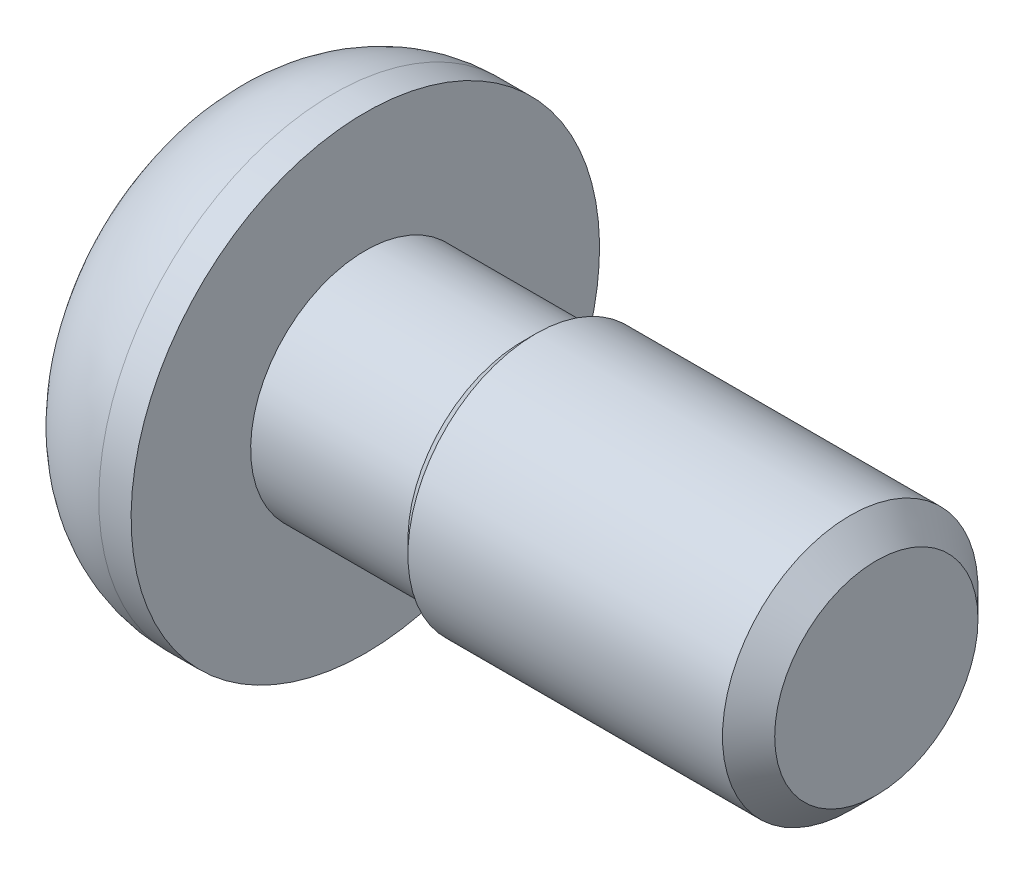
ISO-10303-21;
HEADER;
FILE_DESCRIPTION(('STEP AP214'),'2;1');
FILE_NAME('part.step','',(''),(''),'','','');
FILE_SCHEMA(('AUTOMOTIVE_DESIGN { 1 0 10303 214 1 1 1 1 }'));
ENDSEC;
DATA;
#1=APPLICATION_CONTEXT('core data for automotive mechanical design processes');
#2=APPLICATION_PROTOCOL_DEFINITION('international standard','automotive_design',2000,#1);
#3=PRODUCT_CONTEXT('',#1,'mechanical');
#4=PRODUCT('Part','Part','',(#3));
#5=PRODUCT_RELATED_PRODUCT_CATEGORY('part','',(#4));
#6=PRODUCT_DEFINITION_FORMATION('','',#4);
#7=PRODUCT_DEFINITION_CONTEXT('part definition',#1,'design');
#8=PRODUCT_DEFINITION('design','',#6,#7);
#9=PRODUCT_DEFINITION_SHAPE('','',#8);
#10=(LENGTH_UNIT() NAMED_UNIT(*) SI_UNIT(.MILLI.,.METRE.));
#11=(NAMED_UNIT(*) PLANE_ANGLE_UNIT() SI_UNIT($,.RADIAN.));
#12=(NAMED_UNIT(*) SI_UNIT($,.STERADIAN.) SOLID_ANGLE_UNIT());
#13=UNCERTAINTY_MEASURE_WITH_UNIT(LENGTH_MEASURE(1.E-05),#10,'distance_accuracy_value','');
#14=(GEOMETRIC_REPRESENTATION_CONTEXT(3) GLOBAL_UNCERTAINTY_ASSIGNED_CONTEXT((#13)) GLOBAL_UNIT_ASSIGNED_CONTEXT((#10,
#11,#12)) REPRESENTATION_CONTEXT('',''));
#15=CARTESIAN_POINT('',(0.,0.,0.));
#16=DIRECTION('',(0.,0.,1.));
#17=DIRECTION('',(1.,0.,0.));
#18=AXIS2_PLACEMENT_3D('',#15,#16,#17);
#19=CARTESIAN_POINT('',(6.,0.,0.));
#20=DIRECTION('',(-1.,0.,0.));
#21=DIRECTION('',(0.,1.,0.));
#22=AXIS2_PLACEMENT_3D('',#19,#20,#21);
#23=SPHERICAL_SURFACE('',#22,8.00000000001466);
#24=CARTESIAN_POINT('',(-1.85067742904444,0.,0.));
#25=DIRECTION('',(-1.,0.,0.));
#26=DIRECTION('',(0.,-1.,0.));
#27=AXIS2_PLACEMENT_3D('',#24,#25,#26);
#28=CIRCLE('',#27,1.53846153846195);
#29=CARTESIAN_POINT('',(-1.85067742904444,-1.53846153846195,0.));
#30=VERTEX_POINT('',#29);
#31=EDGE_CURVE('E172',#30,#30,#28,.T.);
#32=ORIENTED_EDGE('',*,*,#31,.T.);
#33=EDGE_LOOP('',(#32));
#34=FACE_BOUND('',#33,.T.);
#35=CARTESIAN_POINT('',(6.,0.,1.375));
#36=DIRECTION('',(0.,0.,-1.));
#37=DIRECTION('',(-1.,0.,0.));
#38=AXIS2_PLACEMENT_3D('',#35,#36,#37);
#39=CIRCLE('',#38,7.88095013308894);
#40=CARTESIAN_POINT('',(-1.87241580175934,-0.36666666666667,1.375));
#41=VERTEX_POINT('',#40);
#42=CARTESIAN_POINT('',(-1.87241580175934,0.36666666666667,1.375));
#43=VERTEX_POINT('',#42);
#44=EDGE_CURVE('E11',#41,#43,#39,.T.);
#45=ORIENTED_EDGE('',*,*,#44,.F.);
#46=CARTESIAN_POINT('',(6.,-0.36666666666667,0.));
#47=DIRECTION('',(0.,1.,0.));
#48=DIRECTION('',(0.,0.,1.));
#49=AXIS2_PLACEMENT_3D('',#46,#47,#48);
#50=CIRCLE('',#49,7.99159280467856);
#51=CARTESIAN_POINT('',(-1.93884612384019,-0.36666666666667,0.91666666666667));
#52=VERTEX_POINT('',#51);
#53=EDGE_CURVE('E25',#52,#41,#50,.T.);
#54=ORIENTED_EDGE('',*,*,#53,.F.);
#55=CARTESIAN_POINT('',(-1.93882302641135,-0.91686666666667,0.366666703030308));
#56=CARTESIAN_POINT('',(-1.94236579166882,-0.886222200606678,0.366628670387705));
#57=CARTESIAN_POINT('',(-1.94560835674475,-0.855543983536852,0.369204204670334));
#58=CARTESIAN_POINT('',(-1.95141306925127,-0.794990855893896,0.379424229843119));
#59=CARTESIAN_POINT('',(-1.95397550408806,-0.765115610816673,0.387066574833851));
#60=CARTESIAN_POINT('',(-1.9583447493943,-0.706989514847591,0.407270037804322));
#61=CARTESIAN_POINT('',(-1.96015097760314,-0.678739930056586,0.419834931670268));
#62=CARTESIAN_POINT('',(-1.96295165273787,-0.624719190912915,0.449530912826694));
#63=CARTESIAN_POINT('',(-1.96394635456326,-0.598947260577293,0.466660564087769));
#64=CARTESIAN_POINT('',(-1.96509060656341,-0.550797400114779,0.504868515459533));
#65=CARTESIAN_POINT('',(-1.9652461206589,-0.528396622612462,0.525917848620626));
#66=CARTESIAN_POINT('',(-1.96472336000751,-0.487409172016811,0.571447602649381));
#67=CARTESIAN_POINT('',(-1.96404495900616,-0.468823076962378,0.595928542563994));
#68=CARTESIAN_POINT('',(-1.96187804733257,-0.436044509781448,0.647530766896138));
#69=CARTESIAN_POINT('',(-1.96039204951636,-0.421838622324701,0.674643648138644));
#70=CARTESIAN_POINT('',(-1.95665486221181,-0.398128991564686,0.730799606671975));
#71=CARTESIAN_POINT('',(-1.95440396125797,-0.388623478514725,0.759841952817276));
#72=CARTESIAN_POINT('',(-1.94996832916546,-0.376616544653103,0.810326624124974));
#73=CARTESIAN_POINT('',(-1.94795786421894,-0.372878488434745,0.831499367654234));
#74=CARTESIAN_POINT('',(-1.94362067788188,-0.367899438514063,0.874073712749798));
#75=CARTESIAN_POINT('',(-1.9412944106657,-0.366654898517597,0.895474945714617));
#76=CARTESIAN_POINT('',(-1.93882302641135,-0.366666703030308,0.91686666666667));
#77=B_SPLINE_CURVE_WITH_KNOTS('',3,(#55,#56,#57,#58,#59,#60,#61,#62,#63,#64,#65,#66,#67,#68,#69,
#70,#71,#72,#73,#74,#75,#76),.UNSPECIFIED.,.F.,.F.,(4,2,2,2,2,2,2,2,2,2,4),(0.,
0.0924335454797331,0.184827968421997,0.277293402553931,0.369729782206797,0.461508363362269,
0.553300841476887,0.644809326910827,0.736283332031252,0.800925072979105,0.865474814600254),.UNSPECIFIED.);
#78=CARTESIAN_POINT('',(-1.93884612384019,-0.91666666666667,0.36666666666667));
#79=VERTEX_POINT('',#78);
#80=EDGE_CURVE('E260',#79,#52,#77,.T.);
#81=ORIENTED_EDGE('',*,*,#80,.F.);
#82=CARTESIAN_POINT('',(6.,0.,0.36666666666667));
#83=DIRECTION('',(0.,0.,-1.));
#84=DIRECTION('',(-1.,0.,0.));
#85=AXIS2_PLACEMENT_3D('',#82,#83,#84);
#86=CIRCLE('',#85,7.99159280467856);
#87=CARTESIAN_POINT('',(-1.87241580175934,-1.375,0.36666666666667));
#88=VERTEX_POINT('',#87);
#89=EDGE_CURVE('E265',#88,#79,#86,.T.);
#90=ORIENTED_EDGE('',*,*,#89,.F.);
#91=CARTESIAN_POINT('',(6.,-1.375,0.));
#92=DIRECTION('',(0.,1.,0.));
#93=DIRECTION('',(0.,0.,1.));
#94=AXIS2_PLACEMENT_3D('',#91,#92,#93);
#95=CIRCLE('',#94,7.88095013308894);
#96=CARTESIAN_POINT('',(-1.87241580175934,-1.375,-0.36666666666667));
#97=VERTEX_POINT('',#96);
#98=EDGE_CURVE('E266',#97,#88,#95,.T.);
#99=ORIENTED_EDGE('',*,*,#98,.F.);
#100=CARTESIAN_POINT('',(6.,0.,-0.36666666666667));
#101=DIRECTION('',(0.,0.,1.));
#102=DIRECTION('',(1.,0.,0.));
#103=AXIS2_PLACEMENT_3D('',#100,#101,#102);
#104=CIRCLE('',#103,7.99159280467856);
#105=CARTESIAN_POINT('',(-1.93884612384019,-0.91666666666667,-0.36666666666667));
#106=VERTEX_POINT('',#105);
#107=EDGE_CURVE('E232',#106,#97,#104,.T.);
#108=ORIENTED_EDGE('',*,*,#107,.F.);
#109=CARTESIAN_POINT('',(-1.93882302641135,-0.366666703030308,-0.91686666666667));
#110=CARTESIAN_POINT('',(-1.94236579166882,-0.366628670387707,-0.886222200606679));
#111=CARTESIAN_POINT('',(-1.94560835674475,-0.369204204670335,-0.855543983536852));
#112=CARTESIAN_POINT('',(-1.95141306925127,-0.37942422984312,-0.794990855893896));
#113=CARTESIAN_POINT('',(-1.95397550408806,-0.387066574833852,-0.765115610816673));
#114=CARTESIAN_POINT('',(-1.9583447493943,-0.407270037804323,-0.706989514847591));
#115=CARTESIAN_POINT('',(-1.96015097760314,-0.41983493167027,-0.678739930056586));
#116=CARTESIAN_POINT('',(-1.96295165273787,-0.449530912826696,-0.624719190912915));
#117=CARTESIAN_POINT('',(-1.96394635456326,-0.46666056408777,-0.598947260577292));
#118=CARTESIAN_POINT('',(-1.96509060656341,-0.504868515459534,-0.550797400114778));
#119=CARTESIAN_POINT('',(-1.9652461206589,-0.525917848620627,-0.528396622612462));
#120=CARTESIAN_POINT('',(-1.96472336000751,-0.571447602649383,-0.487409172016812));
#121=CARTESIAN_POINT('',(-1.96404495900616,-0.595928542563995,-0.468823076962378));
#122=CARTESIAN_POINT('',(-1.96187804733257,-0.647530766896139,-0.436044509781448));
#123=CARTESIAN_POINT('',(-1.96039204951636,-0.674643648138646,-0.421838622324702));
#124=CARTESIAN_POINT('',(-1.95665486221181,-0.730799606671977,-0.398128991564687));
#125=CARTESIAN_POINT('',(-1.95440396125797,-0.759841952817277,-0.388623478514724));
#126=CARTESIAN_POINT('',(-1.94996832916546,-0.810326624124975,-0.376616544653103));
#127=CARTESIAN_POINT('',(-1.94795786421894,-0.831499367654235,-0.372878488434746));
#128=CARTESIAN_POINT('',(-1.94362067788188,-0.874073712749799,-0.367899438514065));
#129=CARTESIAN_POINT('',(-1.9412944106657,-0.895474945714618,-0.366654898517598));
#130=CARTESIAN_POINT('',(-1.93882302641135,-0.91686666666667,-0.366666703030308));
#131=B_SPLINE_CURVE_WITH_KNOTS('',3,(#109,#110,#111,#112,#113,#114,#115,#116,#117,#118,#119,
#120,#121,#122,#123,#124,#125,#126,#127,#128,#129,#130),.UNSPECIFIED.,.F.,.F.,(4,2,2,2,2,2,2,2,
2,2,4),(0.,0.0924335454797328,0.184827968421997,0.277293402553931,0.369729782206797,
0.461508363362269,0.553300841476887,0.644809326910827,0.736283332031252,0.800925072979104,
0.865474814600252),.UNSPECIFIED.);
#132=CARTESIAN_POINT('',(-1.93884612384019,-0.36666666666667,-0.91666666666667));
#133=VERTEX_POINT('',#132);
#134=EDGE_CURVE('E226',#133,#106,#131,.T.);
#135=ORIENTED_EDGE('',*,*,#134,.F.);
#136=CARTESIAN_POINT('',(6.,-0.36666666666667,0.));
#137=DIRECTION('',(0.,1.,0.));
#138=DIRECTION('',(0.,0.,1.));
#139=AXIS2_PLACEMENT_3D('',#136,#137,#138);
#140=CIRCLE('',#139,7.99159280467856);
#141=CARTESIAN_POINT('',(-1.87241580175934,-0.36666666666667,-1.375));
#142=VERTEX_POINT('',#141);
#143=EDGE_CURVE('E224',#142,#133,#140,.T.);
#144=ORIENTED_EDGE('',*,*,#143,.F.);
#145=CARTESIAN_POINT('',(6.,0.,-1.375));
#146=DIRECTION('',(0.,0.,1.));
#147=DIRECTION('',(1.,0.,0.));
#148=AXIS2_PLACEMENT_3D('',#145,#146,#147);
#149=CIRCLE('',#148,7.88095013308894);
#150=CARTESIAN_POINT('',(-1.87241580175934,0.36666666666667,-1.375));
#151=VERTEX_POINT('',#150);
#152=EDGE_CURVE('E222',#151,#142,#149,.T.);
#153=ORIENTED_EDGE('',*,*,#152,.F.);
#154=CARTESIAN_POINT('',(6.,0.36666666666667,0.));
#155=DIRECTION('',(0.,-1.,0.));
#156=DIRECTION('',(0.,0.,-1.));
#157=AXIS2_PLACEMENT_3D('',#154,#155,#156);
#158=CIRCLE('',#157,7.99159280467856);
#159=CARTESIAN_POINT('',(-1.93884612384019,0.36666666666667,-0.91666666666667));
#160=VERTEX_POINT('',#159);
#161=EDGE_CURVE('E219',#160,#151,#158,.T.);
#162=ORIENTED_EDGE('',*,*,#161,.F.);
#163=CARTESIAN_POINT('',(-1.93882302641135,0.91686666666667,-0.366666703030308));
#164=CARTESIAN_POINT('',(-1.94236579166882,0.886222200606678,-0.366628670387705));
#165=CARTESIAN_POINT('',(-1.94560835674475,0.855543983536852,-0.369204204670334));
#166=CARTESIAN_POINT('',(-1.95141306925127,0.794990855893896,-0.379424229843119));
#167=CARTESIAN_POINT('',(-1.95397550408806,0.765115610816673,-0.387066574833851));
#168=CARTESIAN_POINT('',(-1.9583447493943,0.706989514847591,-0.407270037804322));
#169=CARTESIAN_POINT('',(-1.96015097760314,0.678739930056586,-0.419834931670268));
#170=CARTESIAN_POINT('',(-1.96295165273787,0.624719190912915,-0.449530912826694));
#171=CARTESIAN_POINT('',(-1.96394635456326,0.598947260577293,-0.466660564087769));
#172=CARTESIAN_POINT('',(-1.96509060656341,0.550797400114779,-0.504868515459533));
#173=CARTESIAN_POINT('',(-1.9652461206589,0.528396622612462,-0.525917848620626));
#174=CARTESIAN_POINT('',(-1.96472336000751,0.487409172016811,-0.571447602649381));
#175=CARTESIAN_POINT('',(-1.96404495900616,0.468823076962378,-0.595928542563994));
#176=CARTESIAN_POINT('',(-1.96187804733257,0.436044509781448,-0.647530766896138));
#177=CARTESIAN_POINT('',(-1.96039204951636,0.421838622324701,-0.674643648138644));
#178=CARTESIAN_POINT('',(-1.95665486221181,0.398128991564686,-0.730799606671975));
#179=CARTESIAN_POINT('',(-1.95440396125797,0.388623478514724,-0.759841952817276));
#180=CARTESIAN_POINT('',(-1.94996832916546,0.376616544653103,-0.810326624124974));
#181=CARTESIAN_POINT('',(-1.94795786421894,0.372878488434745,-0.831499367654234));
#182=CARTESIAN_POINT('',(-1.94362067788188,0.367899438514063,-0.874073712749798));
#183=CARTESIAN_POINT('',(-1.9412944106657,0.366654898517597,-0.895474945714617));
#184=CARTESIAN_POINT('',(-1.93882302641135,0.366666703030308,-0.91686666666667));
#185=B_SPLINE_CURVE_WITH_KNOTS('',3,(#163,#164,#165,#166,#167,#168,#169,#170,#171,#172,#173,
#174,#175,#176,#177,#178,#179,#180,#181,#182,#183,#184),.UNSPECIFIED.,.F.,.F.,(4,2,2,2,2,2,2,2,
2,2,4),(0.,0.0924335454797331,0.184827968421997,0.277293402553931,0.369729782206797,
0.461508363362269,0.553300841476887,0.644809326910827,0.736283332031252,0.800925072979105,
0.865474814600254),.UNSPECIFIED.);
#186=CARTESIAN_POINT('',(-1.93884612384019,0.91666666666667,-0.36666666666667));
#187=VERTEX_POINT('',#186);
#188=EDGE_CURVE('E213',#187,#160,#185,.T.);
#189=ORIENTED_EDGE('',*,*,#188,.F.);
#190=CARTESIAN_POINT('',(6.,0.,-0.36666666666667));
#191=DIRECTION('',(0.,0.,1.));
#192=DIRECTION('',(1.,0.,0.));
#193=AXIS2_PLACEMENT_3D('',#190,#191,#192);
#194=CIRCLE('',#193,7.99159280467856);
#195=CARTESIAN_POINT('',(-1.87241580175934,1.375,-0.36666666666667));
#196=VERTEX_POINT('',#195);
#197=EDGE_CURVE('E220',#196,#187,#194,.T.);
#198=ORIENTED_EDGE('',*,*,#197,.F.);
#199=CARTESIAN_POINT('',(6.,1.375,0.));
#200=DIRECTION('',(0.,-1.,0.));
#201=DIRECTION('',(0.,0.,-1.));
#202=AXIS2_PLACEMENT_3D('',#199,#200,#201);
#203=CIRCLE('',#202,7.88095013308894);
#204=CARTESIAN_POINT('',(-1.87241580175934,1.375,0.36666666666667));
#205=VERTEX_POINT('',#204);
#206=EDGE_CURVE('E366',#205,#196,#203,.T.);
#207=ORIENTED_EDGE('',*,*,#206,.F.);
#208=CARTESIAN_POINT('',(6.,0.,0.36666666666667));
#209=DIRECTION('',(0.,0.,-1.));
#210=DIRECTION('',(-1.,0.,0.));
#211=AXIS2_PLACEMENT_3D('',#208,#209,#210);
#212=CIRCLE('',#211,7.99159280467856);
#213=CARTESIAN_POINT('',(-1.93884612384019,0.91666666666667,0.36666666666667));
#214=VERTEX_POINT('',#213);
#215=EDGE_CURVE('E183',#214,#205,#212,.T.);
#216=ORIENTED_EDGE('',*,*,#215,.F.);
#217=CARTESIAN_POINT('',(-1.93882302641135,0.366666703030308,0.91686666666667));
#218=CARTESIAN_POINT('',(-1.94236579166882,0.366628670387707,0.886222200606678));
#219=CARTESIAN_POINT('',(-1.94560835674475,0.369204204670335,0.855543983536852));
#220=CARTESIAN_POINT('',(-1.95141306925127,0.37942422984312,0.794990855893895));
#221=CARTESIAN_POINT('',(-1.95397550408806,0.387066574833852,0.765115610816672));
#222=CARTESIAN_POINT('',(-1.9583447493943,0.407270037804323,0.70698951484759));
#223=CARTESIAN_POINT('',(-1.96015097760314,0.41983493167027,0.678739930056586));
#224=CARTESIAN_POINT('',(-1.96295165273787,0.449530912826697,0.624719190912915));
#225=CARTESIAN_POINT('',(-1.96394635456326,0.46666056408777,0.598947260577292));
#226=CARTESIAN_POINT('',(-1.96509060656341,0.504868515459534,0.550797400114778));
#227=CARTESIAN_POINT('',(-1.9652461206589,0.525917848620627,0.528396622612462));
#228=CARTESIAN_POINT('',(-1.96472336000751,0.571447602649383,0.487409172016812));
#229=CARTESIAN_POINT('',(-1.96404495900616,0.595928542563995,0.468823076962378));
#230=CARTESIAN_POINT('',(-1.96187804733257,0.647530766896139,0.436044509781448));
#231=CARTESIAN_POINT('',(-1.96039204951636,0.674643648138646,0.421838622324702));
#232=CARTESIAN_POINT('',(-1.95665486221181,0.730799606671978,0.398128991564687));
#233=CARTESIAN_POINT('',(-1.95440396125797,0.759841952817278,0.388623478514724));
#234=CARTESIAN_POINT('',(-1.94996832916546,0.810326624124975,0.376616544653103));
#235=CARTESIAN_POINT('',(-1.94795786421894,0.831499367654235,0.372878488434746));
#236=CARTESIAN_POINT('',(-1.94362067788188,0.874073712749799,0.367899438514065));
#237=CARTESIAN_POINT('',(-1.9412944106657,0.895474945714618,0.366654898517598));
#238=CARTESIAN_POINT('',(-1.93882302641135,0.91686666666667,0.366666703030308));
#239=B_SPLINE_CURVE_WITH_KNOTS('',3,(#217,#218,#219,#220,#221,#222,#223,#224,#225,#226,#227,
#228,#229,#230,#231,#232,#233,#234,#235,#236,#237,#238),.UNSPECIFIED.,.F.,.F.,(4,2,2,2,2,2,2,2,
2,2,4),(0.,0.0924335454797334,0.184827968421998,0.277293402553932,0.369729782206797,
0.461508363362269,0.553300841476887,0.644809326910828,0.736283332031253,0.800925072979105,
0.865474814600252),.UNSPECIFIED.);
#240=CARTESIAN_POINT('',(-1.93884612384019,0.36666666666667,0.91666666666667));
#241=VERTEX_POINT('',#240);
#242=EDGE_CURVE('E177',#241,#214,#239,.T.);
#243=ORIENTED_EDGE('',*,*,#242,.F.);
#244=CARTESIAN_POINT('',(6.,0.36666666666667,0.));
#245=DIRECTION('',(0.,-1.,0.));
#246=DIRECTION('',(0.,0.,-1.));
#247=AXIS2_PLACEMENT_3D('',#244,#245,#246);
#248=CIRCLE('',#247,7.99159280467856);
#249=EDGE_CURVE('E175',#43,#241,#248,.T.);
#250=ORIENTED_EDGE('',*,*,#249,.F.);
#251=EDGE_LOOP('',(#45,#54,#81,#90,#99,#108,#135,#144,#153,#162,#189,#198,#207,#216,#243,#250));
#252=FACE_BOUND('',#251,.T.);
#253=ADVANCED_FACE('F17',(#34,#252),#23,.T.);
#254=CARTESIAN_POINT('',(-0.378675411101279,0.,0.));
#255=DIRECTION('',(-1.,0.,0.));
#256=DIRECTION('',(0.,-1.,0.));
#257=AXIS2_PLACEMENT_3D('',#254,#255,#256);
#258=DEGENERATE_TOROIDAL_SURFACE('',#257,1.25000000000085,1.50000000000003,.T.);
#259=ORIENTED_EDGE('',*,*,#31,.F.);
#260=EDGE_LOOP('',(#259));
#261=FACE_BOUND('',#260,.T.);
#262=CARTESIAN_POINT('',(-0.378675411101278,0.,0.));
#263=DIRECTION('',(-1.,0.,0.));
#264=DIRECTION('',(0.,-1.,0.));
#265=AXIS2_PLACEMENT_3D('',#262,#263,#264);
#266=CIRCLE('',#265,2.75000000000089);
#267=CARTESIAN_POINT('',(-0.378675411101278,-2.75000000000089,0.));
#268=VERTEX_POINT('',#267);
#269=EDGE_CURVE('E169',#268,#268,#266,.T.);
#270=ORIENTED_EDGE('',*,*,#269,.T.);
#271=EDGE_LOOP('',(#270));
#272=FACE_BOUND('',#271,.T.);
#273=ADVANCED_FACE('F383',(#261,#272),#258,.T.);
#274=CARTESIAN_POINT('',(6.,0.,0.));
#275=DIRECTION('',(-1.,0.,0.));
#276=DIRECTION('',(0.,-1.,0.));
#277=AXIS2_PLACEMENT_3D('',#274,#275,#276);
#278=CYLINDRICAL_SURFACE('',#277,2.75000000000089);
#279=ORIENTED_EDGE('',*,*,#269,.F.);
#280=EDGE_LOOP('',(#279));
#281=FACE_BOUND('',#280,.T.);
#282=CARTESIAN_POINT('',(0.,0.,0.));
#283=DIRECTION('',(-1.,0.,0.));
#284=DIRECTION('',(0.,-1.,0.));
#285=AXIS2_PLACEMENT_3D('',#282,#283,#284);
#286=CIRCLE('',#285,2.75000000000089);
#287=CARTESIAN_POINT('',(0.,-2.75000000000089,0.));
#288=VERTEX_POINT('',#287);
#289=EDGE_CURVE('E166',#288,#288,#286,.T.);
#290=ORIENTED_EDGE('',*,*,#289,.T.);
#291=EDGE_LOOP('',(#290));
#292=FACE_BOUND('',#291,.T.);
#293=ADVANCED_FACE('F389',(#281,#292),#278,.T.);
#294=CARTESIAN_POINT('',(0.,2.75000000000089,0.));
#295=DIRECTION('',(-1.,0.,0.));
#296=DIRECTION('',(0.,-1.,0.));
#297=AXIS2_PLACEMENT_3D('',#294,#295,#296);
#298=PLANE('',#297);
#299=ORIENTED_EDGE('',*,*,#289,.F.);
#300=EDGE_LOOP('',(#299));
#301=FACE_BOUND('',#300,.T.);
#302=CARTESIAN_POINT('',(0.,0.,0.));
#303=DIRECTION('',(-1.,0.,0.));
#304=DIRECTION('',(0.,-1.,0.));
#305=AXIS2_PLACEMENT_3D('',#302,#303,#304);
#306=CIRCLE('',#305,1.34641625);
#307=CARTESIAN_POINT('',(0.,-1.34641625,0.));
#308=VERTEX_POINT('',#307);
#309=EDGE_CURVE('E163',#308,#308,#306,.T.);
#310=ORIENTED_EDGE('',*,*,#309,.T.);
#311=EDGE_LOOP('',(#310));
#312=FACE_BOUND('',#311,.T.);
#313=ADVANCED_FACE('F397',(#301,#312),#298,.F.);
#314=CARTESIAN_POINT('',(6.,0.,0.));
#315=DIRECTION('',(-1.,0.,0.));
#316=DIRECTION('',(0.,-1.,0.));
#317=AXIS2_PLACEMENT_3D('',#314,#315,#316);
#318=CYLINDRICAL_SURFACE('',#317,1.34641625);
#319=ORIENTED_EDGE('',*,*,#309,.F.);
#320=EDGE_LOOP('',(#319));
#321=FACE_BOUND('',#320,.T.);
#322=CARTESIAN_POINT('',(1.84641625,0.,0.));
#323=DIRECTION('',(-1.,0.,0.));
#324=DIRECTION('',(0.,-1.,0.));
#325=AXIS2_PLACEMENT_3D('',#322,#323,#324);
#326=CIRCLE('',#325,1.34641625);
#327=CARTESIAN_POINT('',(1.84641625,-1.34641625,0.));
#328=VERTEX_POINT('',#327);
#329=EDGE_CURVE('E160',#328,#328,#326,.T.);
#330=ORIENTED_EDGE('',*,*,#329,.T.);
#331=EDGE_LOOP('',(#330));
#332=FACE_BOUND('',#331,.T.);
#333=ADVANCED_FACE('F403',(#321,#332),#318,.T.);
#334=CARTESIAN_POINT('',(2.,0.,0.));
#335=DIRECTION('',(1.,0.,0.));
#336=DIRECTION('',(0.,1.,0.));
#337=AXIS2_PLACEMENT_3D('',#334,#335,#336);
#338=CONICAL_SURFACE('',#337,1.5,0.785398163397447);
#339=ORIENTED_EDGE('',*,*,#329,.F.);
#340=EDGE_LOOP('',(#339));
#341=FACE_BOUND('',#340,.T.);
#342=CARTESIAN_POINT('',(2.,0.,0.));
#343=DIRECTION('',(-1.,0.,0.));
#344=DIRECTION('',(0.,-1.,0.));
#345=AXIS2_PLACEMENT_3D('',#342,#343,#344);
#346=CIRCLE('',#345,1.5);
#347=CARTESIAN_POINT('',(2.,-1.5,0.));
#348=VERTEX_POINT('',#347);
#349=EDGE_CURVE('E157',#348,#348,#346,.T.);
#350=ORIENTED_EDGE('',*,*,#349,.T.);
#351=EDGE_LOOP('',(#350));
#352=FACE_BOUND('',#351,.T.);
#353=ADVANCED_FACE('F409',(#341,#352),#338,.T.);
#354=CARTESIAN_POINT('',(6.,0.,0.));
#355=DIRECTION('',(-1.,0.,0.));
#356=DIRECTION('',(0.,-1.,0.));
#357=AXIS2_PLACEMENT_3D('',#354,#355,#356);
#358=CYLINDRICAL_SURFACE('',#357,1.5);
#359=ORIENTED_EDGE('',*,*,#349,.F.);
#360=EDGE_LOOP('',(#359));
#361=FACE_BOUND('',#360,.T.);
#362=CARTESIAN_POINT('',(5.6935,0.,0.));
#363=DIRECTION('',(-1.,0.,0.));
#364=DIRECTION('',(0.,-1.,0.));
#365=AXIS2_PLACEMENT_3D('',#362,#363,#364);
#366=CIRCLE('',#365,1.5);
#367=CARTESIAN_POINT('',(5.6935,-1.5,0.));
#368=VERTEX_POINT('',#367);
#369=EDGE_CURVE('E149',#368,#368,#366,.T.);
#370=ORIENTED_EDGE('',*,*,#369,.T.);
#371=EDGE_LOOP('',(#370));
#372=FACE_BOUND('',#371,.T.);
#373=ADVANCED_FACE('F415',(#361,#372),#358,.T.);
#374=CARTESIAN_POINT('',(6.,0.,0.));
#375=DIRECTION('',(-1.,0.,0.));
#376=DIRECTION('',(0.,-1.,0.));
#377=AXIS2_PLACEMENT_3D('',#374,#375,#376);
#378=CONICAL_SURFACE('',#377,1.1935,0.785398163397448);
#379=ORIENTED_EDGE('',*,*,#369,.F.);
#380=EDGE_LOOP('',(#379));
#381=FACE_BOUND('',#380,.T.);
#382=CARTESIAN_POINT('',(6.,0.,0.));
#383=DIRECTION('',(-1.,0.,0.));
#384=DIRECTION('',(0.,-1.,0.));
#385=AXIS2_PLACEMENT_3D('',#382,#383,#384);
#386=CIRCLE('',#385,1.1935);
#387=CARTESIAN_POINT('',(6.,-1.1935,0.));
#388=VERTEX_POINT('',#387);
#389=EDGE_CURVE('E145',#388,#388,#386,.T.);
#390=ORIENTED_EDGE('',*,*,#389,.T.);
#391=EDGE_LOOP('',(#390));
#392=FACE_BOUND('',#391,.T.);
#393=ADVANCED_FACE('F421',(#381,#392),#378,.T.);
#394=CARTESIAN_POINT('',(6.,1.1935,0.));
#395=DIRECTION('',(-1.,0.,0.));
#396=DIRECTION('',(0.,-1.,0.));
#397=AXIS2_PLACEMENT_3D('',#394,#395,#396);
#398=PLANE('',#397);
#399=ORIENTED_EDGE('',*,*,#389,.F.);
#400=EDGE_LOOP('',(#399));
#401=FACE_BOUND('',#400,.T.);
#402=ADVANCED_FACE('F427',(#401),#398,.F.);
#403=CARTESIAN_POINT('',(-1.33333333333333,0.36666666666667,1.375));
#404=DIRECTION('',(0.,0.,-1.));
#405=DIRECTION('',(-1.,0.,0.));
#406=AXIS2_PLACEMENT_3D('',#403,#404,#405);
#407=PLANE('',#406);
#408=ORIENTED_EDGE('',*,*,#44,.T.);
#409=DIRECTION('',(-1.,0.,0.));
#410=VECTOR('',#409,1.);
#411=CARTESIAN_POINT('',(-1.33333333333333,0.36666666666667,1.375));
#412=LINE('',#411,#410);
#413=CARTESIAN_POINT('',(-1.33333333333333,0.36666666666667,1.375));
#414=VERTEX_POINT('',#413);
#415=EDGE_CURVE('E32',#414,#43,#412,.T.);
#416=ORIENTED_EDGE('',*,*,#415,.F.);
#417=DIRECTION('',(0.,-1.,0.));
#418=VECTOR('',#417,1.);
#419=CARTESIAN_POINT('',(-1.33333333333333,0.36666666666667,1.375));
#420=LINE('',#419,#418);
#421=CARTESIAN_POINT('',(-1.33333333333333,-0.36666666666667,1.375));
#422=VERTEX_POINT('',#421);
#423=EDGE_CURVE('E134',#414,#422,#420,.T.);
#424=ORIENTED_EDGE('',*,*,#423,.T.);
#425=DIRECTION('',(-1.,0.,0.));
#426=VECTOR('',#425,1.);
#427=CARTESIAN_POINT('',(-1.33333333333333,-0.36666666666667,1.375));
#428=LINE('',#427,#426);
#429=EDGE_CURVE('E141',#422,#41,#428,.T.);
#430=ORIENTED_EDGE('',*,*,#429,.T.);
#431=EDGE_LOOP('',(#408,#416,#424,#430));
#432=FACE_BOUND('',#431,.T.);
#433=ADVANCED_FACE('F140',(#432),#407,.T.);
#434=CARTESIAN_POINT('',(-1.33333333333333,-0.36666666666667,1.375));
#435=DIRECTION('',(0.,1.,0.));
#436=DIRECTION('',(0.,0.,1.));
#437=AXIS2_PLACEMENT_3D('',#434,#435,#436);
#438=PLANE('',#437);
#439=ORIENTED_EDGE('',*,*,#53,.T.);
#440=ORIENTED_EDGE('',*,*,#429,.F.);
#441=DIRECTION('',(0.,0.,-1.));
#442=VECTOR('',#441,1.);
#443=CARTESIAN_POINT('',(-1.33333333333333,-0.36666666666667,1.375));
#444=LINE('',#443,#442);
#445=CARTESIAN_POINT('',(-1.33333333333333,-0.36666666666667,0.91666666666667));
#446=VERTEX_POINT('',#445);
#447=EDGE_CURVE('E130',#422,#446,#444,.T.);
#448=ORIENTED_EDGE('',*,*,#447,.T.);
#449=DIRECTION('',(-1.,0.,0.));
#450=VECTOR('',#449,1.);
#451=CARTESIAN_POINT('',(-1.33333333333333,-0.36666666666667,0.91666666666667));
#452=LINE('',#451,#450);
#453=EDGE_CURVE('E146',#446,#52,#452,.T.);
#454=ORIENTED_EDGE('',*,*,#453,.T.);
#455=EDGE_LOOP('',(#439,#440,#448,#454));
#456=FACE_BOUND('',#455,.T.);
#457=ADVANCED_FACE('F144',(#456),#438,.T.);
#458=CARTESIAN_POINT('',(-1.33333333333333,-0.916666666666674,0.916666666666674));
#459=DIRECTION('',(-1.,0.,0.));
#460=DIRECTION('',(0.,0.,1.));
#461=AXIS2_PLACEMENT_3D('',#458,#459,#460);
#462=CYLINDRICAL_SURFACE('',#461,0.55);
#463=ORIENTED_EDGE('',*,*,#80,.T.);
#464=ORIENTED_EDGE('',*,*,#453,.F.);
#465=CARTESIAN_POINT('',(-1.33333333333333,-0.916666666666674,0.916666666666674));
#466=DIRECTION('',(-1.,0.,0.));
#467=DIRECTION('',(0.,0.,1.));
#468=AXIS2_PLACEMENT_3D('',#465,#466,#467);
#469=CIRCLE('',#468,0.55);
#470=CARTESIAN_POINT('',(-1.33333333333333,-0.91666666666667,0.36666666666667));
#471=VERTEX_POINT('',#470);
#472=EDGE_CURVE('E136',#446,#471,#469,.T.);
#473=ORIENTED_EDGE('',*,*,#472,.T.);
#474=DIRECTION('',(-1.,0.,0.));
#475=VECTOR('',#474,1.);
#476=CARTESIAN_POINT('',(-1.33333333333333,-0.91666666666667,0.36666666666667));
#477=LINE('',#476,#475);
#478=EDGE_CURVE('E151',#471,#79,#477,.T.);
#479=ORIENTED_EDGE('',*,*,#478,.T.);
#480=EDGE_LOOP('',(#463,#464,#473,#479));
#481=FACE_BOUND('',#480,.T.);
#482=ADVANCED_FACE('F252',(#481),#462,.T.);
#483=CARTESIAN_POINT('',(-1.33333333333333,-0.91666666666667,0.36666666666667));
#484=DIRECTION('',(0.,0.,-1.));
#485=DIRECTION('',(-1.,0.,0.));
#486=AXIS2_PLACEMENT_3D('',#483,#484,#485);
#487=PLANE('',#486);
#488=ORIENTED_EDGE('',*,*,#89,.T.);
#489=ORIENTED_EDGE('',*,*,#478,.F.);
#490=DIRECTION('',(0.,-1.,0.));
#491=VECTOR('',#490,1.);
#492=CARTESIAN_POINT('',(-1.33333333333333,-0.91666666666667,0.36666666666667));
#493=LINE('',#492,#491);
#494=CARTESIAN_POINT('',(-1.33333333333333,-1.375,0.36666666666667));
#495=VERTEX_POINT('',#494);
#496=EDGE_CURVE('E342',#471,#495,#493,.T.);
#497=ORIENTED_EDGE('',*,*,#496,.T.);
#498=DIRECTION('',(-1.,0.,0.));
#499=VECTOR('',#498,1.);
#500=CARTESIAN_POINT('',(-1.33333333333333,-1.375,0.36666666666667));
#501=LINE('',#500,#499);
#502=EDGE_CURVE('E282',#495,#88,#501,.T.);
#503=ORIENTED_EDGE('',*,*,#502,.T.);
#504=EDGE_LOOP('',(#488,#489,#497,#503));
#505=FACE_BOUND('',#504,.T.);
#506=ADVANCED_FACE('F248',(#505),#487,.T.);
#507=CARTESIAN_POINT('',(-1.33333333333333,-1.375,0.36666666666667));
#508=DIRECTION('',(0.,1.,0.));
#509=DIRECTION('',(0.,0.,1.));
#510=AXIS2_PLACEMENT_3D('',#507,#508,#509);
#511=PLANE('',#510);
#512=ORIENTED_EDGE('',*,*,#98,.T.);
#513=ORIENTED_EDGE('',*,*,#502,.F.);
#514=DIRECTION('',(0.,0.,-1.));
#515=VECTOR('',#514,1.);
#516=CARTESIAN_POINT('',(-1.33333333333333,-1.375,0.36666666666667));
#517=LINE('',#516,#515);
#518=CARTESIAN_POINT('',(-1.33333333333333,-1.375,-0.36666666666667));
#519=VERTEX_POINT('',#518);
#520=EDGE_CURVE('E281',#495,#519,#517,.T.);
#521=ORIENTED_EDGE('',*,*,#520,.T.);
#522=DIRECTION('',(-1.,0.,0.));
#523=VECTOR('',#522,1.);
#524=CARTESIAN_POINT('',(-1.33333333333333,-1.375,-0.36666666666667));
#525=LINE('',#524,#523);
#526=EDGE_CURVE('E274',#519,#97,#525,.T.);
#527=ORIENTED_EDGE('',*,*,#526,.T.);
#528=EDGE_LOOP('',(#512,#513,#521,#527));
#529=FACE_BOUND('',#528,.T.);
#530=ADVANCED_FACE('F244',(#529),#511,.T.);
#531=CARTESIAN_POINT('',(-1.33333333333333,-1.375,-0.36666666666667));
#532=DIRECTION('',(0.,0.,1.));
#533=DIRECTION('',(1.,0.,0.));
#534=AXIS2_PLACEMENT_3D('',#531,#532,#533);
#535=PLANE('',#534);
#536=ORIENTED_EDGE('',*,*,#107,.T.);
#537=ORIENTED_EDGE('',*,*,#526,.F.);
#538=DIRECTION('',(0.,1.,0.));
#539=VECTOR('',#538,1.);
#540=CARTESIAN_POINT('',(-1.33333333333333,-1.375,-0.36666666666667));
#541=LINE('',#540,#539);
#542=CARTESIAN_POINT('',(-1.33333333333333,-0.91666666666667,-0.36666666666667));
#543=VERTEX_POINT('',#542);
#544=EDGE_CURVE('E339',#519,#543,#541,.T.);
#545=ORIENTED_EDGE('',*,*,#544,.T.);
#546=DIRECTION('',(-1.,0.,0.));
#547=VECTOR('',#546,1.);
#548=CARTESIAN_POINT('',(-1.33333333333333,-0.91666666666667,-0.36666666666667));
#549=LINE('',#548,#547);
#550=EDGE_CURVE('E277',#543,#106,#549,.T.);
#551=ORIENTED_EDGE('',*,*,#550,.T.);
#552=EDGE_LOOP('',(#536,#537,#545,#551));
#553=FACE_BOUND('',#552,.T.);
#554=ADVANCED_FACE('F240',(#553),#535,.T.);
#555=CARTESIAN_POINT('',(-1.33333333333333,-0.916666666666675,-0.916666666666675));
#556=DIRECTION('',(-1.,0.,0.));
#557=DIRECTION('',(0.,0.,1.));
#558=AXIS2_PLACEMENT_3D('',#555,#556,#557);
#559=CYLINDRICAL_SURFACE('',#558,0.55);
#560=ORIENTED_EDGE('',*,*,#134,.T.);
#561=ORIENTED_EDGE('',*,*,#550,.F.);
#562=CARTESIAN_POINT('',(-1.33333333333333,-0.916666666666675,-0.916666666666675));
#563=DIRECTION('',(-1.,0.,0.));
#564=DIRECTION('',(0.,0.,1.));
#565=AXIS2_PLACEMENT_3D('',#562,#563,#564);
#566=CIRCLE('',#565,0.55);
#567=CARTESIAN_POINT('',(-1.33333333333333,-0.36666666666667,-0.91666666666667));
#568=VERTEX_POINT('',#567);
#569=EDGE_CURVE('E337',#543,#568,#566,.T.);
#570=ORIENTED_EDGE('',*,*,#569,.T.);
#571=DIRECTION('',(-1.,0.,0.));
#572=VECTOR('',#571,1.);
#573=CARTESIAN_POINT('',(-1.33333333333333,-0.36666666666667,-0.91666666666667));
#574=LINE('',#573,#572);
#575=EDGE_CURVE('E291',#568,#133,#574,.T.);
#576=ORIENTED_EDGE('',*,*,#575,.T.);
#577=EDGE_LOOP('',(#560,#561,#570,#576));
#578=FACE_BOUND('',#577,.T.);
#579=ADVANCED_FACE('F234',(#578),#559,.T.);
#580=CARTESIAN_POINT('',(-1.33333333333333,-0.36666666666667,-0.91666666666667));
#581=DIRECTION('',(0.,1.,0.));
#582=DIRECTION('',(0.,0.,1.));
#583=AXIS2_PLACEMENT_3D('',#580,#581,#582);
#584=PLANE('',#583);
#585=ORIENTED_EDGE('',*,*,#143,.T.);
#586=ORIENTED_EDGE('',*,*,#575,.F.);
#587=DIRECTION('',(0.,0.,-1.));
#588=VECTOR('',#587,1.);
#589=CARTESIAN_POINT('',(-1.33333333333333,-0.36666666666667,-0.91666666666667));
#590=LINE('',#589,#588);
#591=CARTESIAN_POINT('',(-1.33333333333333,-0.36666666666667,-1.375));
#592=VERTEX_POINT('',#591);
#593=EDGE_CURVE('E335',#568,#592,#590,.T.);
#594=ORIENTED_EDGE('',*,*,#593,.T.);
#595=DIRECTION('',(-1.,0.,0.));
#596=VECTOR('',#595,1.);
#597=CARTESIAN_POINT('',(-1.33333333333333,-0.36666666666667,-1.375));
#598=LINE('',#597,#596);
#599=EDGE_CURVE('E294',#592,#142,#598,.T.);
#600=ORIENTED_EDGE('',*,*,#599,.T.);
#601=EDGE_LOOP('',(#585,#586,#594,#600));
#602=FACE_BOUND('',#601,.T.);
#603=ADVANCED_FACE('F239',(#602),#584,.T.);
#604=CARTESIAN_POINT('',(-1.33333333333333,-0.36666666666667,-1.375));
#605=DIRECTION('',(0.,0.,1.));
#606=DIRECTION('',(1.,0.,0.));
#607=AXIS2_PLACEMENT_3D('',#604,#605,#606);
#608=PLANE('',#607);
#609=ORIENTED_EDGE('',*,*,#152,.T.);
#610=ORIENTED_EDGE('',*,*,#599,.F.);
#611=DIRECTION('',(0.,1.,0.));
#612=VECTOR('',#611,1.);
#613=CARTESIAN_POINT('',(-1.33333333333333,-0.36666666666667,-1.375));
#614=LINE('',#613,#612);
#615=CARTESIAN_POINT('',(-1.33333333333333,0.36666666666667,-1.375));
#616=VERTEX_POINT('',#615);
#617=EDGE_CURVE('E333',#592,#616,#614,.T.);
#618=ORIENTED_EDGE('',*,*,#617,.T.);
#619=DIRECTION('',(-1.,0.,0.));
#620=VECTOR('',#619,1.);
#621=CARTESIAN_POINT('',(-1.33333333333333,0.36666666666667,-1.375));
#622=LINE('',#621,#620);
#623=EDGE_CURVE('E297',#616,#151,#622,.T.);
#624=ORIENTED_EDGE('',*,*,#623,.T.);
#625=EDGE_LOOP('',(#609,#610,#618,#624));
#626=FACE_BOUND('',#625,.T.);
#627=ADVANCED_FACE('F354',(#626),#608,.T.);
#628=CARTESIAN_POINT('',(-1.33333333333333,0.36666666666667,-1.375));
#629=DIRECTION('',(0.,-1.,0.));
#630=DIRECTION('',(0.,0.,-1.));
#631=AXIS2_PLACEMENT_3D('',#628,#629,#630);
#632=PLANE('',#631);
#633=ORIENTED_EDGE('',*,*,#161,.T.);
#634=ORIENTED_EDGE('',*,*,#623,.F.);
#635=DIRECTION('',(0.,0.,1.));
#636=VECTOR('',#635,1.);
#637=CARTESIAN_POINT('',(-1.33333333333333,0.36666666666667,-1.375));
#638=LINE('',#637,#636);
#639=CARTESIAN_POINT('',(-1.33333333333333,0.36666666666667,-0.91666666666667));
#640=VERTEX_POINT('',#639);
#641=EDGE_CURVE('E331',#616,#640,#638,.T.);
#642=ORIENTED_EDGE('',*,*,#641,.T.);
#643=DIRECTION('',(-1.,0.,0.));
#644=VECTOR('',#643,1.);
#645=CARTESIAN_POINT('',(-1.33333333333333,0.36666666666667,-0.91666666666667));
#646=LINE('',#645,#644);
#647=EDGE_CURVE('E300',#640,#160,#646,.T.);
#648=ORIENTED_EDGE('',*,*,#647,.T.);
#649=EDGE_LOOP('',(#633,#634,#642,#648));
#650=FACE_BOUND('',#649,.T.);
#651=ADVANCED_FACE('F209',(#650),#632,.T.);
#652=CARTESIAN_POINT('',(-1.33333333333333,0.916666666666674,-0.916666666666674));
#653=DIRECTION('',(-1.,0.,0.));
#654=DIRECTION('',(0.,0.,1.));
#655=AXIS2_PLACEMENT_3D('',#652,#653,#654);
#656=CYLINDRICAL_SURFACE('',#655,0.55);
#657=ORIENTED_EDGE('',*,*,#188,.T.);
#658=ORIENTED_EDGE('',*,*,#647,.F.);
#659=CARTESIAN_POINT('',(-1.33333333333333,0.916666666666674,-0.916666666666674));
#660=DIRECTION('',(-1.,0.,0.));
#661=DIRECTION('',(0.,0.,1.));
#662=AXIS2_PLACEMENT_3D('',#659,#660,#661);
#663=CIRCLE('',#662,0.55);
#664=CARTESIAN_POINT('',(-1.33333333333333,0.91666666666667,-0.36666666666667));
#665=VERTEX_POINT('',#664);
#666=EDGE_CURVE('E329',#640,#665,#663,.T.);
#667=ORIENTED_EDGE('',*,*,#666,.T.);
#668=DIRECTION('',(-1.,0.,0.));
#669=VECTOR('',#668,1.);
#670=CARTESIAN_POINT('',(-1.33333333333333,0.91666666666667,-0.36666666666667));
#671=LINE('',#670,#669);
#672=EDGE_CURVE('E303',#665,#187,#671,.T.);
#673=ORIENTED_EDGE('',*,*,#672,.T.);
#674=EDGE_LOOP('',(#657,#658,#667,#673));
#675=FACE_BOUND('',#674,.T.);
#676=ADVANCED_FACE('F204',(#675),#656,.T.);
#677=CARTESIAN_POINT('',(-1.33333333333333,0.91666666666667,-0.36666666666667));
#678=DIRECTION('',(0.,0.,1.));
#679=DIRECTION('',(1.,0.,0.));
#680=AXIS2_PLACEMENT_3D('',#677,#678,#679);
#681=PLANE('',#680);
#682=ORIENTED_EDGE('',*,*,#197,.T.);
#683=ORIENTED_EDGE('',*,*,#672,.F.);
#684=DIRECTION('',(0.,1.,0.));
#685=VECTOR('',#684,1.);
#686=CARTESIAN_POINT('',(-1.33333333333333,0.91666666666667,-0.36666666666667));
#687=LINE('',#686,#685);
#688=CARTESIAN_POINT('',(-1.33333333333333,1.375,-0.36666666666667));
#689=VERTEX_POINT('',#688);
#690=EDGE_CURVE('E327',#665,#689,#687,.T.);
#691=ORIENTED_EDGE('',*,*,#690,.T.);
#692=DIRECTION('',(-1.,0.,0.));
#693=VECTOR('',#692,1.);
#694=CARTESIAN_POINT('',(-1.33333333333333,1.375,-0.36666666666667));
#695=LINE('',#694,#693);
#696=EDGE_CURVE('E306',#689,#196,#695,.T.);
#697=ORIENTED_EDGE('',*,*,#696,.T.);
#698=EDGE_LOOP('',(#682,#683,#691,#697));
#699=FACE_BOUND('',#698,.T.);
#700=ADVANCED_FACE('F200',(#699),#681,.T.);
#701=CARTESIAN_POINT('',(-1.33333333333333,1.375,-0.36666666666667));
#702=DIRECTION('',(0.,-1.,0.));
#703=DIRECTION('',(0.,0.,-1.));
#704=AXIS2_PLACEMENT_3D('',#701,#702,#703);
#705=PLANE('',#704);
#706=ORIENTED_EDGE('',*,*,#206,.T.);
#707=ORIENTED_EDGE('',*,*,#696,.F.);
#708=DIRECTION('',(0.,0.,1.));
#709=VECTOR('',#708,1.);
#710=CARTESIAN_POINT('',(-1.33333333333333,1.375,-0.36666666666667));
#711=LINE('',#710,#709);
#712=CARTESIAN_POINT('',(-1.33333333333333,1.375,0.36666666666667));
#713=VERTEX_POINT('',#712);
#714=EDGE_CURVE('E325',#689,#713,#711,.T.);
#715=ORIENTED_EDGE('',*,*,#714,.T.);
#716=DIRECTION('',(-1.,0.,0.));
#717=VECTOR('',#716,1.);
#718=CARTESIAN_POINT('',(-1.33333333333333,1.375,0.36666666666667));
#719=LINE('',#718,#717);
#720=EDGE_CURVE('E309',#713,#205,#719,.T.);
#721=ORIENTED_EDGE('',*,*,#720,.T.);
#722=EDGE_LOOP('',(#706,#707,#715,#721));
#723=FACE_BOUND('',#722,.T.);
#724=ADVANCED_FACE('F196',(#723),#705,.T.);
#725=CARTESIAN_POINT('',(-1.33333333333333,1.375,0.36666666666667));
#726=DIRECTION('',(0.,0.,-1.));
#727=DIRECTION('',(-1.,0.,0.));
#728=AXIS2_PLACEMENT_3D('',#725,#726,#727);
#729=PLANE('',#728);
#730=ORIENTED_EDGE('',*,*,#215,.T.);
#731=ORIENTED_EDGE('',*,*,#720,.F.);
#732=DIRECTION('',(0.,-1.,0.));
#733=VECTOR('',#732,1.);
#734=CARTESIAN_POINT('',(-1.33333333333333,1.375,0.36666666666667));
#735=LINE('',#734,#733);
#736=CARTESIAN_POINT('',(-1.33333333333333,0.91666666666667,0.36666666666667));
#737=VERTEX_POINT('',#736);
#738=EDGE_CURVE('E323',#713,#737,#735,.T.);
#739=ORIENTED_EDGE('',*,*,#738,.T.);
#740=DIRECTION('',(-1.,0.,0.));
#741=VECTOR('',#740,1.);
#742=CARTESIAN_POINT('',(-1.33333333333333,0.91666666666667,0.36666666666667));
#743=LINE('',#742,#741);
#744=EDGE_CURVE('E312',#737,#214,#743,.T.);
#745=ORIENTED_EDGE('',*,*,#744,.T.);
#746=EDGE_LOOP('',(#730,#731,#739,#745));
#747=FACE_BOUND('',#746,.T.);
#748=ADVANCED_FACE('F191',(#747),#729,.T.);
#749=CARTESIAN_POINT('',(-1.33333333333333,0.916666666666675,0.916666666666675));
#750=DIRECTION('',(-1.,0.,0.));
#751=DIRECTION('',(0.,0.,1.));
#752=AXIS2_PLACEMENT_3D('',#749,#750,#751);
#753=CYLINDRICAL_SURFACE('',#752,0.55);
#754=ORIENTED_EDGE('',*,*,#242,.T.);
#755=ORIENTED_EDGE('',*,*,#744,.F.);
#756=CARTESIAN_POINT('',(-1.33333333333333,0.916666666666675,0.916666666666675));
#757=DIRECTION('',(-1.,0.,0.));
#758=DIRECTION('',(0.,0.,1.));
#759=AXIS2_PLACEMENT_3D('',#756,#757,#758);
#760=CIRCLE('',#759,0.55);
#761=CARTESIAN_POINT('',(-1.33333333333333,0.36666666666667,0.91666666666667));
#762=VERTEX_POINT('',#761);
#763=EDGE_CURVE('E321',#737,#762,#760,.T.);
#764=ORIENTED_EDGE('',*,*,#763,.T.);
#765=DIRECTION('',(-1.,0.,0.));
#766=VECTOR('',#765,1.);
#767=CARTESIAN_POINT('',(-1.33333333333333,0.36666666666667,0.91666666666667));
#768=LINE('',#767,#766);
#769=EDGE_CURVE('E315',#762,#241,#768,.T.);
#770=ORIENTED_EDGE('',*,*,#769,.T.);
#771=EDGE_LOOP('',(#754,#755,#764,#770));
#772=FACE_BOUND('',#771,.T.);
#773=ADVANCED_FACE('F185',(#772),#753,.T.);
#774=CARTESIAN_POINT('',(-1.33333333333333,0.36666666666667,0.91666666666667));
#775=DIRECTION('',(0.,-1.,0.));
#776=DIRECTION('',(0.,0.,-1.));
#777=AXIS2_PLACEMENT_3D('',#774,#775,#776);
#778=PLANE('',#777);
#779=ORIENTED_EDGE('',*,*,#249,.T.);
#780=ORIENTED_EDGE('',*,*,#769,.F.);
#781=DIRECTION('',(0.,0.,1.));
#782=VECTOR('',#781,1.);
#783=CARTESIAN_POINT('',(-1.33333333333333,0.36666666666667,0.91666666666667));
#784=LINE('',#783,#782);
#785=EDGE_CURVE('E319',#762,#414,#784,.T.);
#786=ORIENTED_EDGE('',*,*,#785,.T.);
#787=ORIENTED_EDGE('',*,*,#415,.T.);
#788=EDGE_LOOP('',(#779,#780,#786,#787));
#789=FACE_BOUND('',#788,.T.);
#790=ADVANCED_FACE('F190',(#789),#778,.T.);
#791=CARTESIAN_POINT('',(-1.33333333333333,-0.916666666666674,0.916666666666674));
#792=DIRECTION('',(-1.,0.,0.));
#793=DIRECTION('',(0.,0.,1.));
#794=AXIS2_PLACEMENT_3D('',#791,#792,#793);
#795=PLANE('',#794);
#796=ORIENTED_EDGE('',*,*,#423,.F.);
#797=ORIENTED_EDGE('',*,*,#785,.F.);
#798=ORIENTED_EDGE('',*,*,#763,.F.);
#799=ORIENTED_EDGE('',*,*,#738,.F.);
#800=ORIENTED_EDGE('',*,*,#714,.F.);
#801=ORIENTED_EDGE('',*,*,#690,.F.);
#802=ORIENTED_EDGE('',*,*,#666,.F.);
#803=ORIENTED_EDGE('',*,*,#641,.F.);
#804=ORIENTED_EDGE('',*,*,#617,.F.);
#805=ORIENTED_EDGE('',*,*,#593,.F.);
#806=ORIENTED_EDGE('',*,*,#569,.F.);
#807=ORIENTED_EDGE('',*,*,#544,.F.);
#808=ORIENTED_EDGE('',*,*,#520,.F.);
#809=ORIENTED_EDGE('',*,*,#496,.F.);
#810=ORIENTED_EDGE('',*,*,#472,.F.);
#811=ORIENTED_EDGE('',*,*,#447,.F.);
#812=EDGE_LOOP('',(#796,#797,#798,#799,#800,#801,#802,#803,#804,#805,#806,#807,#808,#809,#810,#811));
#813=FACE_BOUND('',#812,.T.);
#814=ADVANCED_FACE('F132',(#813),#795,.T.);
#815=CLOSED_SHELL('',(#253,#273,#293,#313,#333,#353,#373,#393,#402,#433,#457,#482,#506,#530,
#554,#579,#603,#627,#651,#676,#700,#724,#748,#773,#790,#814));
#816=MANIFOLD_SOLID_BREP('B1',#815);
#817=ADVANCED_BREP_SHAPE_REPRESENTATION('',(#18,#816),#14);
#818=SHAPE_DEFINITION_REPRESENTATION(#9,#817);
ENDSEC;
END-ISO-10303-21;
